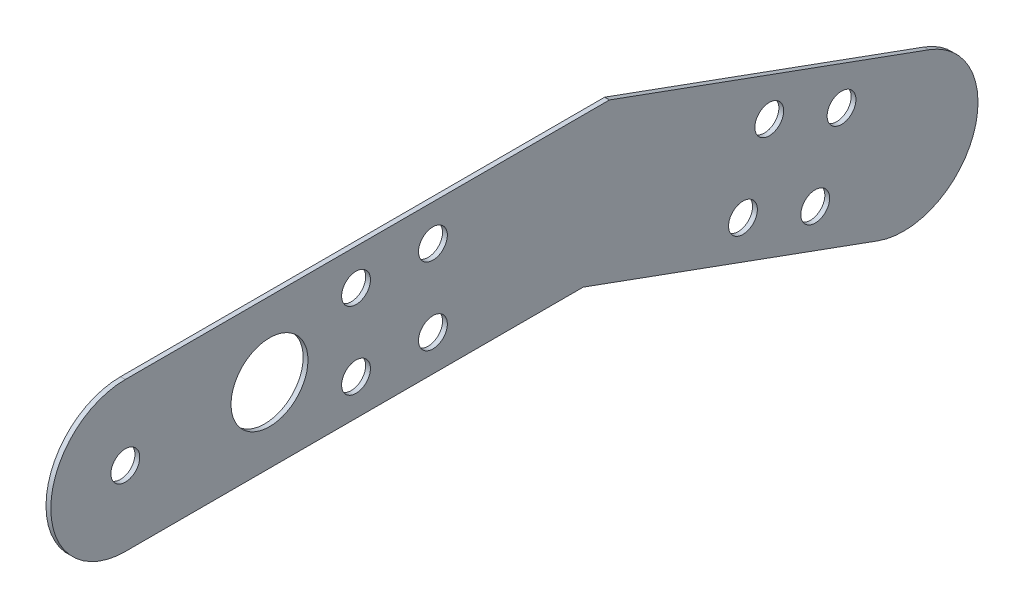
ISO-10303-21;
HEADER;
FILE_DESCRIPTION(('STEP AP214'),'2;1');
FILE_NAME('part.step','',(''),(''),'','','');
FILE_SCHEMA(('AUTOMOTIVE_DESIGN { 1 0 10303 214 1 1 1 1 }'));
ENDSEC;
DATA;
#1=APPLICATION_CONTEXT('core data for automotive mechanical design processes');
#2=APPLICATION_PROTOCOL_DEFINITION('international standard','automotive_design',2000,#1);
#3=PRODUCT_CONTEXT('',#1,'mechanical');
#4=PRODUCT('Part','Part','',(#3));
#5=PRODUCT_RELATED_PRODUCT_CATEGORY('part','',(#4));
#6=PRODUCT_DEFINITION_FORMATION('','',#4);
#7=PRODUCT_DEFINITION_CONTEXT('part definition',#1,'design');
#8=PRODUCT_DEFINITION('design','',#6,#7);
#9=PRODUCT_DEFINITION_SHAPE('','',#8);
#10=(LENGTH_UNIT() NAMED_UNIT(*) SI_UNIT(.MILLI.,.METRE.));
#11=(NAMED_UNIT(*) PLANE_ANGLE_UNIT() SI_UNIT($,.RADIAN.));
#12=(NAMED_UNIT(*) SI_UNIT($,.STERADIAN.) SOLID_ANGLE_UNIT());
#13=UNCERTAINTY_MEASURE_WITH_UNIT(LENGTH_MEASURE(1.E-05),#10,'distance_accuracy_value','');
#14=(GEOMETRIC_REPRESENTATION_CONTEXT(3) GLOBAL_UNCERTAINTY_ASSIGNED_CONTEXT((#13)) GLOBAL_UNIT_ASSIGNED_CONTEXT((#10,
#11,#12)) REPRESENTATION_CONTEXT('',''));
#15=CARTESIAN_POINT('',(0.,0.,0.));
#16=DIRECTION('',(0.,0.,1.));
#17=DIRECTION('',(1.,0.,0.));
#18=AXIS2_PLACEMENT_3D('',#15,#16,#17);
#19=CARTESIAN_POINT('',(-0.5,13.5559898477157,43.6047670509665));
#20=DIRECTION('',(1.,0.,0.));
#21=DIRECTION('',(0.,0.,-1.));
#22=AXIS2_PLACEMENT_3D('',#19,#20,#21);
#23=CYLINDRICAL_SURFACE('',#22,7.75);
#24=CARTESIAN_POINT('',(0.,13.5559898477157,43.6047670509665));
#25=DIRECTION('',(1.,0.,0.));
#26=DIRECTION('',(0.,0.,1.));
#27=AXIS2_PLACEMENT_3D('',#24,#25,#26);
#28=CIRCLE('',#27,7.75);
#29=CARTESIAN_POINT('',(0.,21.3059898477157,43.6047670509665));
#30=VERTEX_POINT('',#29);
#31=CARTESIAN_POINT('',(0.,5.80598984771574,43.6047670509665));
#32=VERTEX_POINT('',#31);
#33=EDGE_CURVE('E119',#30,#32,#28,.T.);
#34=ORIENTED_EDGE('',*,*,#33,.F.);
#35=DIRECTION('',(1.,0.,0.));
#36=VECTOR('',#35,1.);
#37=CARTESIAN_POINT('',(-0.5,21.3059898477157,43.6047670509665));
#38=LINE('',#37,#36);
#39=CARTESIAN_POINT('',(-0.5,21.3059898477157,43.6047670509665));
#40=VERTEX_POINT('',#39);
#41=EDGE_CURVE('E11',#40,#30,#38,.T.);
#42=ORIENTED_EDGE('',*,*,#41,.F.);
#43=CARTESIAN_POINT('',(-0.5,13.5559898477157,43.6047670509665));
#44=DIRECTION('',(1.,0.,0.));
#45=DIRECTION('',(0.,0.,1.));
#46=AXIS2_PLACEMENT_3D('',#43,#44,#45);
#47=CIRCLE('',#46,7.75);
#48=CARTESIAN_POINT('',(-0.5,5.80598984771574,43.6047670509665));
#49=VERTEX_POINT('',#48);
#50=EDGE_CURVE('E134',#40,#49,#47,.T.);
#51=ORIENTED_EDGE('',*,*,#50,.T.);
#52=DIRECTION('',(1.,0.,0.));
#53=VECTOR('',#52,1.);
#54=CARTESIAN_POINT('',(-0.5,5.80598984771574,43.6047670509665));
#55=LINE('',#54,#53);
#56=EDGE_CURVE('E37',#49,#32,#55,.T.);
#57=ORIENTED_EDGE('',*,*,#56,.T.);
#58=EDGE_LOOP('',(#34,#42,#51,#57));
#59=FACE_BOUND('',#58,.T.);
#60=ADVANCED_FACE('F34',(#59),#23,.T.);
#61=CARTESIAN_POINT('',(-0.5,21.3059898477157,43.6047670509665));
#62=DIRECTION('',(0.,1.,0.));
#63=DIRECTION('',(0.,0.,1.));
#64=AXIS2_PLACEMENT_3D('',#61,#62,#63);
#65=PLANE('',#64);
#66=DIRECTION('',(0.,0.,1.));
#67=VECTOR('',#66,1.);
#68=CARTESIAN_POINT('',(0.,21.3059898477157,43.6047670509665));
#69=LINE('',#68,#67);
#70=CARTESIAN_POINT('',(0.,21.3059898477157,-6.76176704952414));
#71=VERTEX_POINT('',#70);
#72=EDGE_CURVE('E132',#71,#30,#69,.T.);
#73=ORIENTED_EDGE('',*,*,#72,.F.);
#74=DIRECTION('',(1.,0.,0.));
#75=VECTOR('',#74,1.);
#76=CARTESIAN_POINT('',(-0.5,21.3059898477157,-6.76176704952414));
#77=LINE('',#76,#75);
#78=CARTESIAN_POINT('',(-0.5,21.3059898477157,-6.76176704952414));
#79=VERTEX_POINT('',#78);
#80=EDGE_CURVE('E43',#79,#71,#77,.T.);
#81=ORIENTED_EDGE('',*,*,#80,.F.);
#82=DIRECTION('',(0.,0.,1.));
#83=VECTOR('',#82,1.);
#84=CARTESIAN_POINT('',(-0.5,21.3059898477157,43.6047670509665));
#85=LINE('',#84,#83);
#86=EDGE_CURVE('E109',#79,#40,#85,.T.);
#87=ORIENTED_EDGE('',*,*,#86,.T.);
#88=ORIENTED_EDGE('',*,*,#41,.T.);
#89=EDGE_LOOP('',(#73,#81,#87,#88));
#90=FACE_BOUND('',#89,.T.);
#91=ADVANCED_FACE('F142',(#90),#65,.T.);
#92=CARTESIAN_POINT('',(-0.5,21.3059898477157,-6.76176704952414));
#93=DIRECTION('',(0.,0.939692620785908,-0.342020143325669));
#94=DIRECTION('',(0.,0.342020143325669,0.939692620785908));
#95=AXIS2_PLACEMENT_3D('',#92,#93,#94);
#96=PLANE('',#95);
#97=DIRECTION('',(0.,0.342020143325669,0.939692620785908));
#98=VECTOR('',#97,1.);
#99=CARTESIAN_POINT('',(0.,21.3059898477157,-6.76176704952414));
#100=LINE('',#99,#98);
#101=CARTESIAN_POINT('',(0.,9.20992278573377,-39.9954381665284));
#102=VERTEX_POINT('',#101);
#103=EDGE_CURVE('E96',#102,#71,#100,.T.);
#104=ORIENTED_EDGE('',*,*,#103,.F.);
#105=DIRECTION('',(1.,0.,0.));
#106=VECTOR('',#105,1.);
#107=CARTESIAN_POINT('',(-0.5,9.20992278573377,-39.9954381665284));
#108=LINE('',#107,#106);
#109=CARTESIAN_POINT('',(-0.5,9.20992278573377,-39.9954381665284));
#110=VERTEX_POINT('',#109);
#111=EDGE_CURVE('E91',#110,#102,#108,.T.);
#112=ORIENTED_EDGE('',*,*,#111,.F.);
#113=DIRECTION('',(0.,0.342020143325669,0.939692620785908));
#114=VECTOR('',#113,1.);
#115=CARTESIAN_POINT('',(-0.5,21.3059898477157,-6.76176704952414));
#116=LINE('',#115,#114);
#117=EDGE_CURVE('E94',#110,#79,#116,.T.);
#118=ORIENTED_EDGE('',*,*,#117,.T.);
#119=ORIENTED_EDGE('',*,*,#80,.T.);
#120=EDGE_LOOP('',(#104,#112,#118,#119));
#121=FACE_BOUND('',#120,.T.);
#122=ADVANCED_FACE('F93',(#121),#96,.T.);
#123=CARTESIAN_POINT('',(-0.5,1.92730497464299,-37.3447820557544));
#124=DIRECTION('',(1.,0.,0.));
#125=DIRECTION('',(0.,0.,-1.));
#126=AXIS2_PLACEMENT_3D('',#123,#124,#125);
#127=CYLINDRICAL_SURFACE('',#126,7.75);
#128=CARTESIAN_POINT('',(0.,1.92730497464299,-37.3447820557544));
#129=DIRECTION('',(1.,0.,0.));
#130=DIRECTION('',(0.,0.,-1.));
#131=AXIS2_PLACEMENT_3D('',#128,#129,#130);
#132=CIRCLE('',#131,7.75);
#133=CARTESIAN_POINT('',(0.,-5.3553128364478,-34.6941259449805));
#134=VERTEX_POINT('',#133);
#135=EDGE_CURVE('E129',#134,#102,#132,.T.);
#136=ORIENTED_EDGE('',*,*,#135,.F.);
#137=DIRECTION('',(1.,0.,0.));
#138=VECTOR('',#137,1.);
#139=CARTESIAN_POINT('',(-0.5,-5.3553128364478,-34.6941259449805));
#140=LINE('',#139,#138);
#141=CARTESIAN_POINT('',(-0.5,-5.3553128364478,-34.6941259449805));
#142=VERTEX_POINT('',#141);
#143=EDGE_CURVE('E101',#142,#134,#140,.T.);
#144=ORIENTED_EDGE('',*,*,#143,.F.);
#145=CARTESIAN_POINT('',(-0.5,1.92730497464299,-37.3447820557544));
#146=DIRECTION('',(1.,0.,0.));
#147=DIRECTION('',(0.,0.,-1.));
#148=AXIS2_PLACEMENT_3D('',#145,#146,#147);
#149=CIRCLE('',#148,7.75);
#150=EDGE_CURVE('E107',#142,#110,#149,.T.);
#151=ORIENTED_EDGE('',*,*,#150,.T.);
#152=ORIENTED_EDGE('',*,*,#111,.T.);
#153=EDGE_LOOP('',(#136,#144,#151,#152));
#154=FACE_BOUND('',#153,.T.);
#155=ADVANCED_FACE('F111',(#154),#127,.T.);
#156=CARTESIAN_POINT('',(-0.5,5.80598984771574,-4.02869884854293));
#157=DIRECTION('',(0.,-0.939692620785908,0.342020143325669));
#158=DIRECTION('',(0.,-0.342020143325669,-0.939692620785908));
#159=AXIS2_PLACEMENT_3D('',#156,#157,#158);
#160=PLANE('',#159);
#161=DIRECTION('',(0.,-0.342020143325669,-0.939692620785908));
#162=VECTOR('',#161,1.);
#163=CARTESIAN_POINT('',(0.,5.80598984771574,-4.02869884854293));
#164=LINE('',#163,#162);
#165=CARTESIAN_POINT('',(0.,5.80598984771574,-4.02869884854293));
#166=VERTEX_POINT('',#165);
#167=EDGE_CURVE('E126',#166,#134,#164,.T.);
#168=ORIENTED_EDGE('',*,*,#167,.F.);
#169=DIRECTION('',(1.,0.,0.));
#170=VECTOR('',#169,1.);
#171=CARTESIAN_POINT('',(-0.5,5.80598984771574,-4.02869884854293));
#172=LINE('',#171,#170);
#173=CARTESIAN_POINT('',(-0.5,5.80598984771574,-4.02869884854293));
#174=VERTEX_POINT('',#173);
#175=EDGE_CURVE('E137',#174,#166,#172,.T.);
#176=ORIENTED_EDGE('',*,*,#175,.F.);
#177=DIRECTION('',(0.,-0.342020143325669,-0.939692620785908));
#178=VECTOR('',#177,1.);
#179=CARTESIAN_POINT('',(-0.5,5.80598984771574,-4.02869884854293));
#180=LINE('',#179,#178);
#181=EDGE_CURVE('E112',#174,#142,#180,.T.);
#182=ORIENTED_EDGE('',*,*,#181,.T.);
#183=ORIENTED_EDGE('',*,*,#143,.T.);
#184=EDGE_LOOP('',(#168,#176,#182,#183));
#185=FACE_BOUND('',#184,.T.);
#186=ADVANCED_FACE('F155',(#185),#160,.T.);
#187=CARTESIAN_POINT('',(-0.5,5.80598984771574,43.6047670509665));
#188=DIRECTION('',(0.,-1.,0.));
#189=DIRECTION('',(0.,0.,-1.));
#190=AXIS2_PLACEMENT_3D('',#187,#188,#189);
#191=PLANE('',#190);
#192=DIRECTION('',(0.,0.,-1.));
#193=VECTOR('',#192,1.);
#194=CARTESIAN_POINT('',(0.,5.80598984771574,43.6047670509665));
#195=LINE('',#194,#193);
#196=EDGE_CURVE('E122',#32,#166,#195,.T.);
#197=ORIENTED_EDGE('',*,*,#196,.F.);
#198=ORIENTED_EDGE('',*,*,#56,.F.);
#199=DIRECTION('',(0.,0.,-1.));
#200=VECTOR('',#199,1.);
#201=CARTESIAN_POINT('',(-0.5,5.80598984771574,43.6047670509665));
#202=LINE('',#201,#200);
#203=EDGE_CURVE('E114',#49,#174,#202,.T.);
#204=ORIENTED_EDGE('',*,*,#203,.T.);
#205=ORIENTED_EDGE('',*,*,#175,.T.);
#206=EDGE_LOOP('',(#197,#198,#204,#205));
#207=FACE_BOUND('',#206,.T.);
#208=ADVANCED_FACE('F139',(#207),#191,.T.);
#209=CARTESIAN_POINT('',(-0.5,13.5559898477157,43.6047670509665));
#210=DIRECTION('',(-1.,0.,0.));
#211=DIRECTION('',(0.,0.,1.));
#212=AXIS2_PLACEMENT_3D('',#209,#210,#211);
#213=PLANE('',#212);
#214=CARTESIAN_POINT('',(-0.5,9.55598984771574,11.6047670509665));
#215=DIRECTION('',(1.,0.,0.));
#216=DIRECTION('',(0.,0.,1.));
#217=AXIS2_PLACEMENT_3D('',#214,#215,#216);
#218=CIRCLE('',#217,1.5);
#219=CARTESIAN_POINT('',(-0.5,9.55598984771574,13.1047670509665));
#220=VERTEX_POINT('',#219);
#221=EDGE_CURVE('E213',#220,#220,#218,.T.);
#222=ORIENTED_EDGE('',*,*,#221,.T.);
#223=EDGE_LOOP('',(#222));
#224=FACE_BOUND('',#223,.T.);
#225=CARTESIAN_POINT('',(-0.5,17.5559898477157,11.6047670509665));
#226=DIRECTION('',(1.,0.,0.));
#227=DIRECTION('',(0.,0.,-1.));
#228=AXIS2_PLACEMENT_3D('',#225,#226,#227);
#229=CIRCLE('',#228,1.5);
#230=CARTESIAN_POINT('',(-0.5,17.5559898477157,10.1047670509665));
#231=VERTEX_POINT('',#230);
#232=EDGE_CURVE('E221',#231,#231,#229,.T.);
#233=ORIENTED_EDGE('',*,*,#232,.T.);
#234=EDGE_LOOP('',(#233));
#235=FACE_BOUND('',#234,.T.);
#236=CARTESIAN_POINT('',(-0.5,1.01302468697578,-28.1615289005202));
#237=DIRECTION('',(1.,0.,0.));
#238=DIRECTION('',(0.,0.,1.));
#239=AXIS2_PLACEMENT_3D('',#236,#237,#238);
#240=CIRCLE('',#239,1.50000000000001);
#241=CARTESIAN_POINT('',(-0.5,1.01302468697578,-26.6615289005202));
#242=VERTEX_POINT('',#241);
#243=EDGE_CURVE('E227',#242,#242,#240,.T.);
#244=ORIENTED_EDGE('',*,*,#243,.T.);
#245=EDGE_LOOP('',(#244));
#246=FACE_BOUND('',#245,.T.);
#247=CARTESIAN_POINT('',(-0.5,8.53056565326303,-30.8976900471256));
#248=DIRECTION('',(1.,0.,0.));
#249=DIRECTION('',(0.,0.,-1.));
#250=AXIS2_PLACEMENT_3D('',#247,#248,#249);
#251=CIRCLE('',#250,1.50000000000002);
#252=CARTESIAN_POINT('',(-0.5,8.53056565326303,-32.3976900471256));
#253=VERTEX_POINT('',#252);
#254=EDGE_CURVE('E233',#253,#253,#251,.T.);
#255=ORIENTED_EDGE('',*,*,#254,.T.);
#256=EDGE_LOOP('',(#255));
#257=FACE_BOUND('',#256,.T.);
#258=CARTESIAN_POINT('',(-0.5,13.5559898477157,28.6047670509665));
#259=DIRECTION('',(1.,0.,0.));
#260=DIRECTION('',(0.,0.,-1.));
#261=AXIS2_PLACEMENT_3D('',#258,#259,#260);
#262=CIRCLE('',#261,4.);
#263=CARTESIAN_POINT('',(-0.5,13.5559898477157,24.6047670509665));
#264=VERTEX_POINT('',#263);
#265=EDGE_CURVE('E239',#264,#264,#262,.T.);
#266=ORIENTED_EDGE('',*,*,#265,.T.);
#267=EDGE_LOOP('',(#266));
#268=FACE_BOUND('',#267,.T.);
#269=CARTESIAN_POINT('',(-0.5,3.74918583358112,-20.643987934233));
#270=DIRECTION('',(1.,0.,0.));
#271=DIRECTION('',(0.,0.,1.));
#272=AXIS2_PLACEMENT_3D('',#269,#270,#271);
#273=CIRCLE('',#272,1.5);
#274=CARTESIAN_POINT('',(-0.5,3.74918583358112,-19.143987934233));
#275=VERTEX_POINT('',#274);
#276=EDGE_CURVE('E245',#275,#275,#273,.T.);
#277=ORIENTED_EDGE('',*,*,#276,.T.);
#278=EDGE_LOOP('',(#277));
#279=FACE_BOUND('',#278,.T.);
#280=CARTESIAN_POINT('',(-0.5,11.2667267998684,-23.3801490808383));
#281=DIRECTION('',(1.,0.,0.));
#282=DIRECTION('',(0.,0.,-1.));
#283=AXIS2_PLACEMENT_3D('',#280,#281,#282);
#284=CIRCLE('',#283,1.5);
#285=CARTESIAN_POINT('',(-0.5,11.2667267998684,-24.8801490808383));
#286=VERTEX_POINT('',#285);
#287=EDGE_CURVE('E251',#286,#286,#284,.T.);
#288=ORIENTED_EDGE('',*,*,#287,.T.);
#289=EDGE_LOOP('',(#288));
#290=FACE_BOUND('',#289,.T.);
#291=CARTESIAN_POINT('',(-0.5,9.55598984771574,19.6047670509665));
#292=DIRECTION('',(1.,0.,0.));
#293=DIRECTION('',(0.,0.,1.));
#294=AXIS2_PLACEMENT_3D('',#291,#292,#293);
#295=CIRCLE('',#294,1.5);
#296=CARTESIAN_POINT('',(-0.5,9.55598984771574,21.1047670509665));
#297=VERTEX_POINT('',#296);
#298=EDGE_CURVE('E257',#297,#297,#295,.T.);
#299=ORIENTED_EDGE('',*,*,#298,.T.);
#300=EDGE_LOOP('',(#299));
#301=FACE_BOUND('',#300,.T.);
#302=CARTESIAN_POINT('',(-0.5,13.5559898477157,43.6047670509665));
#303=DIRECTION('',(1.,0.,0.));
#304=DIRECTION('',(0.,0.,-1.));
#305=AXIS2_PLACEMENT_3D('',#302,#303,#304);
#306=CIRCLE('',#305,1.5);
#307=CARTESIAN_POINT('',(-0.5,13.5559898477157,42.1047670509665));
#308=VERTEX_POINT('',#307);
#309=EDGE_CURVE('E263',#308,#308,#306,.T.);
#310=ORIENTED_EDGE('',*,*,#309,.T.);
#311=EDGE_LOOP('',(#310));
#312=FACE_BOUND('',#311,.T.);
#313=CARTESIAN_POINT('',(-0.5,17.5559898477157,19.6047670509665));
#314=DIRECTION('',(1.,0.,0.));
#315=DIRECTION('',(0.,0.,-1.));
#316=AXIS2_PLACEMENT_3D('',#313,#314,#315);
#317=CIRCLE('',#316,1.5);
#318=CARTESIAN_POINT('',(-0.5,17.5559898477157,18.1047670509665));
#319=VERTEX_POINT('',#318);
#320=EDGE_CURVE('E123',#319,#319,#317,.T.);
#321=ORIENTED_EDGE('',*,*,#320,.T.);
#322=EDGE_LOOP('',(#321));
#323=FACE_BOUND('',#322,.T.);
#324=ORIENTED_EDGE('',*,*,#50,.F.);
#325=ORIENTED_EDGE('',*,*,#86,.F.);
#326=ORIENTED_EDGE('',*,*,#117,.F.);
#327=ORIENTED_EDGE('',*,*,#150,.F.);
#328=ORIENTED_EDGE('',*,*,#181,.F.);
#329=ORIENTED_EDGE('',*,*,#203,.F.);
#330=EDGE_LOOP('',(#324,#325,#326,#327,#328,#329));
#331=FACE_BOUND('',#330,.T.);
#332=ADVANCED_FACE('F105',(#224,#235,#246,#257,#268,#279,#290,#301,#312,#323,#331),#213,.T.);
#333=CARTESIAN_POINT('',(0.,13.5559898477157,43.6047670509665));
#334=DIRECTION('',(-1.,0.,0.));
#335=DIRECTION('',(0.,0.,1.));
#336=AXIS2_PLACEMENT_3D('',#333,#334,#335);
#337=PLANE('',#336);
#338=CARTESIAN_POINT('',(0.,9.55598984771574,11.6047670509665));
#339=DIRECTION('',(1.,0.,0.));
#340=DIRECTION('',(0.,0.,1.));
#341=AXIS2_PLACEMENT_3D('',#338,#339,#340);
#342=CIRCLE('',#341,1.5);
#343=CARTESIAN_POINT('',(0.,9.55598984771574,13.1047670509665));
#344=VERTEX_POINT('',#343);
#345=EDGE_CURVE('E216',#344,#344,#342,.T.);
#346=ORIENTED_EDGE('',*,*,#345,.F.);
#347=EDGE_LOOP('',(#346));
#348=FACE_BOUND('',#347,.T.);
#349=CARTESIAN_POINT('',(0.,17.5559898477157,11.6047670509665));
#350=DIRECTION('',(1.,0.,0.));
#351=DIRECTION('',(0.,0.,-1.));
#352=AXIS2_PLACEMENT_3D('',#349,#350,#351);
#353=CIRCLE('',#352,1.5);
#354=CARTESIAN_POINT('',(0.,17.5559898477157,10.1047670509665));
#355=VERTEX_POINT('',#354);
#356=EDGE_CURVE('E218',#355,#355,#353,.T.);
#357=ORIENTED_EDGE('',*,*,#356,.F.);
#358=EDGE_LOOP('',(#357));
#359=FACE_BOUND('',#358,.T.);
#360=CARTESIAN_POINT('',(0.,1.01302468697578,-28.1615289005202));
#361=DIRECTION('',(1.,0.,0.));
#362=DIRECTION('',(0.,0.,1.));
#363=AXIS2_PLACEMENT_3D('',#360,#361,#362);
#364=CIRCLE('',#363,1.50000000000001);
#365=CARTESIAN_POINT('',(0.,1.01302468697578,-26.6615289005202));
#366=VERTEX_POINT('',#365);
#367=EDGE_CURVE('E224',#366,#366,#364,.T.);
#368=ORIENTED_EDGE('',*,*,#367,.F.);
#369=EDGE_LOOP('',(#368));
#370=FACE_BOUND('',#369,.T.);
#371=CARTESIAN_POINT('',(0.,8.53056565326303,-30.8976900471256));
#372=DIRECTION('',(1.,0.,0.));
#373=DIRECTION('',(0.,0.,-1.));
#374=AXIS2_PLACEMENT_3D('',#371,#372,#373);
#375=CIRCLE('',#374,1.50000000000002);
#376=CARTESIAN_POINT('',(0.,8.53056565326303,-32.3976900471256));
#377=VERTEX_POINT('',#376);
#378=EDGE_CURVE('E230',#377,#377,#375,.T.);
#379=ORIENTED_EDGE('',*,*,#378,.F.);
#380=EDGE_LOOP('',(#379));
#381=FACE_BOUND('',#380,.T.);
#382=CARTESIAN_POINT('',(0.,13.5559898477157,28.6047670509665));
#383=DIRECTION('',(1.,0.,0.));
#384=DIRECTION('',(0.,0.,-1.));
#385=AXIS2_PLACEMENT_3D('',#382,#383,#384);
#386=CIRCLE('',#385,4.);
#387=CARTESIAN_POINT('',(0.,13.5559898477157,24.6047670509665));
#388=VERTEX_POINT('',#387);
#389=EDGE_CURVE('E236',#388,#388,#386,.T.);
#390=ORIENTED_EDGE('',*,*,#389,.F.);
#391=EDGE_LOOP('',(#390));
#392=FACE_BOUND('',#391,.T.);
#393=CARTESIAN_POINT('',(0.,3.74918583358112,-20.643987934233));
#394=DIRECTION('',(1.,0.,0.));
#395=DIRECTION('',(0.,0.,1.));
#396=AXIS2_PLACEMENT_3D('',#393,#394,#395);
#397=CIRCLE('',#396,1.5);
#398=CARTESIAN_POINT('',(0.,3.74918583358112,-19.143987934233));
#399=VERTEX_POINT('',#398);
#400=EDGE_CURVE('E242',#399,#399,#397,.T.);
#401=ORIENTED_EDGE('',*,*,#400,.F.);
#402=EDGE_LOOP('',(#401));
#403=FACE_BOUND('',#402,.T.);
#404=CARTESIAN_POINT('',(0.,11.2667267998684,-23.3801490808383));
#405=DIRECTION('',(1.,0.,0.));
#406=DIRECTION('',(0.,0.,-1.));
#407=AXIS2_PLACEMENT_3D('',#404,#405,#406);
#408=CIRCLE('',#407,1.5);
#409=CARTESIAN_POINT('',(0.,11.2667267998684,-24.8801490808383));
#410=VERTEX_POINT('',#409);
#411=EDGE_CURVE('E248',#410,#410,#408,.T.);
#412=ORIENTED_EDGE('',*,*,#411,.F.);
#413=EDGE_LOOP('',(#412));
#414=FACE_BOUND('',#413,.T.);
#415=CARTESIAN_POINT('',(0.,9.55598984771574,19.6047670509665));
#416=DIRECTION('',(1.,0.,0.));
#417=DIRECTION('',(0.,0.,1.));
#418=AXIS2_PLACEMENT_3D('',#415,#416,#417);
#419=CIRCLE('',#418,1.5);
#420=CARTESIAN_POINT('',(0.,9.55598984771574,21.1047670509665));
#421=VERTEX_POINT('',#420);
#422=EDGE_CURVE('E254',#421,#421,#419,.T.);
#423=ORIENTED_EDGE('',*,*,#422,.F.);
#424=EDGE_LOOP('',(#423));
#425=FACE_BOUND('',#424,.T.);
#426=CARTESIAN_POINT('',(0.,13.5559898477157,43.6047670509665));
#427=DIRECTION('',(1.,0.,0.));
#428=DIRECTION('',(0.,0.,-1.));
#429=AXIS2_PLACEMENT_3D('',#426,#427,#428);
#430=CIRCLE('',#429,1.5);
#431=CARTESIAN_POINT('',(0.,13.5559898477157,42.1047670509665));
#432=VERTEX_POINT('',#431);
#433=EDGE_CURVE('E260',#432,#432,#430,.T.);
#434=ORIENTED_EDGE('',*,*,#433,.F.);
#435=EDGE_LOOP('',(#434));
#436=FACE_BOUND('',#435,.T.);
#437=CARTESIAN_POINT('',(0.,17.5559898477157,19.6047670509665));
#438=DIRECTION('',(1.,0.,0.));
#439=DIRECTION('',(0.,0.,-1.));
#440=AXIS2_PLACEMENT_3D('',#437,#438,#439);
#441=CIRCLE('',#440,1.5);
#442=CARTESIAN_POINT('',(0.,17.5559898477157,18.1047670509665));
#443=VERTEX_POINT('',#442);
#444=EDGE_CURVE('E266',#443,#443,#441,.T.);
#445=ORIENTED_EDGE('',*,*,#444,.F.);
#446=EDGE_LOOP('',(#445));
#447=FACE_BOUND('',#446,.T.);
#448=ORIENTED_EDGE('',*,*,#33,.T.);
#449=ORIENTED_EDGE('',*,*,#196,.T.);
#450=ORIENTED_EDGE('',*,*,#167,.T.);
#451=ORIENTED_EDGE('',*,*,#135,.T.);
#452=ORIENTED_EDGE('',*,*,#103,.T.);
#453=ORIENTED_EDGE('',*,*,#72,.T.);
#454=EDGE_LOOP('',(#448,#449,#450,#451,#452,#453));
#455=FACE_BOUND('',#454,.T.);
#456=ADVANCED_FACE('F141',(#348,#359,#370,#381,#392,#403,#414,#425,#436,#447,#455),#337,.F.);
#457=CARTESIAN_POINT('',(-0.5,17.5559898477157,19.6047670509665));
#458=DIRECTION('',(1.,0.,0.));
#459=DIRECTION('',(0.,0.,-1.));
#460=AXIS2_PLACEMENT_3D('',#457,#458,#459);
#461=CYLINDRICAL_SURFACE('',#460,1.5);
#462=ORIENTED_EDGE('',*,*,#320,.F.);
#463=EDGE_LOOP('',(#462));
#464=FACE_BOUND('',#463,.T.);
#465=ORIENTED_EDGE('',*,*,#444,.T.);
#466=EDGE_LOOP('',(#465));
#467=FACE_BOUND('',#466,.T.);
#468=ADVANCED_FACE('F166',(#464,#467),#461,.F.);
#469=CARTESIAN_POINT('',(-0.5,13.5559898477157,43.6047670509665));
#470=DIRECTION('',(1.,0.,0.));
#471=DIRECTION('',(0.,0.,-1.));
#472=AXIS2_PLACEMENT_3D('',#469,#470,#471);
#473=CYLINDRICAL_SURFACE('',#472,1.5);
#474=ORIENTED_EDGE('',*,*,#309,.F.);
#475=EDGE_LOOP('',(#474));
#476=FACE_BOUND('',#475,.T.);
#477=ORIENTED_EDGE('',*,*,#433,.T.);
#478=EDGE_LOOP('',(#477));
#479=FACE_BOUND('',#478,.T.);
#480=ADVANCED_FACE('F173',(#476,#479),#473,.F.);
#481=CARTESIAN_POINT('',(-0.5,9.55598984771574,19.6047670509665));
#482=DIRECTION('',(1.,0.,0.));
#483=DIRECTION('',(0.,0.,-1.));
#484=AXIS2_PLACEMENT_3D('',#481,#482,#483);
#485=CYLINDRICAL_SURFACE('',#484,1.5);
#486=ORIENTED_EDGE('',*,*,#298,.F.);
#487=EDGE_LOOP('',(#486));
#488=FACE_BOUND('',#487,.T.);
#489=ORIENTED_EDGE('',*,*,#422,.T.);
#490=EDGE_LOOP('',(#489));
#491=FACE_BOUND('',#490,.T.);
#492=ADVANCED_FACE('F177',(#488,#491),#485,.F.);
#493=CARTESIAN_POINT('',(-0.5,11.2667267998684,-23.3801490808383));
#494=DIRECTION('',(1.,0.,0.));
#495=DIRECTION('',(0.,0.,-1.));
#496=AXIS2_PLACEMENT_3D('',#493,#494,#495);
#497=CYLINDRICAL_SURFACE('',#496,1.5);
#498=ORIENTED_EDGE('',*,*,#287,.F.);
#499=EDGE_LOOP('',(#498));
#500=FACE_BOUND('',#499,.T.);
#501=ORIENTED_EDGE('',*,*,#411,.T.);
#502=EDGE_LOOP('',(#501));
#503=FACE_BOUND('',#502,.T.);
#504=ADVANCED_FACE('F181',(#500,#503),#497,.F.);
#505=CARTESIAN_POINT('',(-0.5,3.74918583358112,-20.643987934233));
#506=DIRECTION('',(1.,0.,0.));
#507=DIRECTION('',(0.,0.,-1.));
#508=AXIS2_PLACEMENT_3D('',#505,#506,#507);
#509=CYLINDRICAL_SURFACE('',#508,1.5);
#510=ORIENTED_EDGE('',*,*,#276,.F.);
#511=EDGE_LOOP('',(#510));
#512=FACE_BOUND('',#511,.T.);
#513=ORIENTED_EDGE('',*,*,#400,.T.);
#514=EDGE_LOOP('',(#513));
#515=FACE_BOUND('',#514,.T.);
#516=ADVANCED_FACE('F185',(#512,#515),#509,.F.);
#517=CARTESIAN_POINT('',(-0.5,13.5559898477157,28.6047670509665));
#518=DIRECTION('',(1.,0.,0.));
#519=DIRECTION('',(0.,0.,-1.));
#520=AXIS2_PLACEMENT_3D('',#517,#518,#519);
#521=CYLINDRICAL_SURFACE('',#520,4.);
#522=ORIENTED_EDGE('',*,*,#265,.F.);
#523=EDGE_LOOP('',(#522));
#524=FACE_BOUND('',#523,.T.);
#525=ORIENTED_EDGE('',*,*,#389,.T.);
#526=EDGE_LOOP('',(#525));
#527=FACE_BOUND('',#526,.T.);
#528=ADVANCED_FACE('F189',(#524,#527),#521,.F.);
#529=CARTESIAN_POINT('',(-0.5,8.53056565326303,-30.8976900471256));
#530=DIRECTION('',(1.,0.,0.));
#531=DIRECTION('',(0.,0.,-1.));
#532=AXIS2_PLACEMENT_3D('',#529,#530,#531);
#533=CYLINDRICAL_SURFACE('',#532,1.50000000000002);
#534=ORIENTED_EDGE('',*,*,#254,.F.);
#535=EDGE_LOOP('',(#534));
#536=FACE_BOUND('',#535,.T.);
#537=ORIENTED_EDGE('',*,*,#378,.T.);
#538=EDGE_LOOP('',(#537));
#539=FACE_BOUND('',#538,.T.);
#540=ADVANCED_FACE('F193',(#536,#539),#533,.F.);
#541=CARTESIAN_POINT('',(-0.5,1.01302468697578,-28.1615289005202));
#542=DIRECTION('',(1.,0.,0.));
#543=DIRECTION('',(0.,0.,-1.));
#544=AXIS2_PLACEMENT_3D('',#541,#542,#543);
#545=CYLINDRICAL_SURFACE('',#544,1.50000000000001);
#546=ORIENTED_EDGE('',*,*,#243,.F.);
#547=EDGE_LOOP('',(#546));
#548=FACE_BOUND('',#547,.T.);
#549=ORIENTED_EDGE('',*,*,#367,.T.);
#550=EDGE_LOOP('',(#549));
#551=FACE_BOUND('',#550,.T.);
#552=ADVANCED_FACE('F197',(#548,#551),#545,.F.);
#553=CARTESIAN_POINT('',(-0.5,17.5559898477157,11.6047670509665));
#554=DIRECTION('',(1.,0.,0.));
#555=DIRECTION('',(0.,0.,-1.));
#556=AXIS2_PLACEMENT_3D('',#553,#554,#555);
#557=CYLINDRICAL_SURFACE('',#556,1.5);
#558=ORIENTED_EDGE('',*,*,#232,.F.);
#559=EDGE_LOOP('',(#558));
#560=FACE_BOUND('',#559,.T.);
#561=ORIENTED_EDGE('',*,*,#356,.T.);
#562=EDGE_LOOP('',(#561));
#563=FACE_BOUND('',#562,.T.);
#564=ADVANCED_FACE('F201',(#560,#563),#557,.F.);
#565=CARTESIAN_POINT('',(-0.5,9.55598984771574,11.6047670509665));
#566=DIRECTION('',(1.,0.,0.));
#567=DIRECTION('',(0.,0.,-1.));
#568=AXIS2_PLACEMENT_3D('',#565,#566,#567);
#569=CYLINDRICAL_SURFACE('',#568,1.5);
#570=ORIENTED_EDGE('',*,*,#221,.F.);
#571=EDGE_LOOP('',(#570));
#572=FACE_BOUND('',#571,.T.);
#573=ORIENTED_EDGE('',*,*,#345,.T.);
#574=EDGE_LOOP('',(#573));
#575=FACE_BOUND('',#574,.T.);
#576=ADVANCED_FACE('F205',(#572,#575),#569,.F.);
#577=CLOSED_SHELL('',(#60,#91,#122,#155,#186,#208,#332,#456,#468,#480,#492,#504,#516,#528,#540,
#552,#564,#576));
#578=MANIFOLD_SOLID_BREP('B2',#577);
#579=ADVANCED_BREP_SHAPE_REPRESENTATION('',(#18,#578),#14);
#580=SHAPE_DEFINITION_REPRESENTATION(#9,#579);
ENDSEC;
END-ISO-10303-21;
